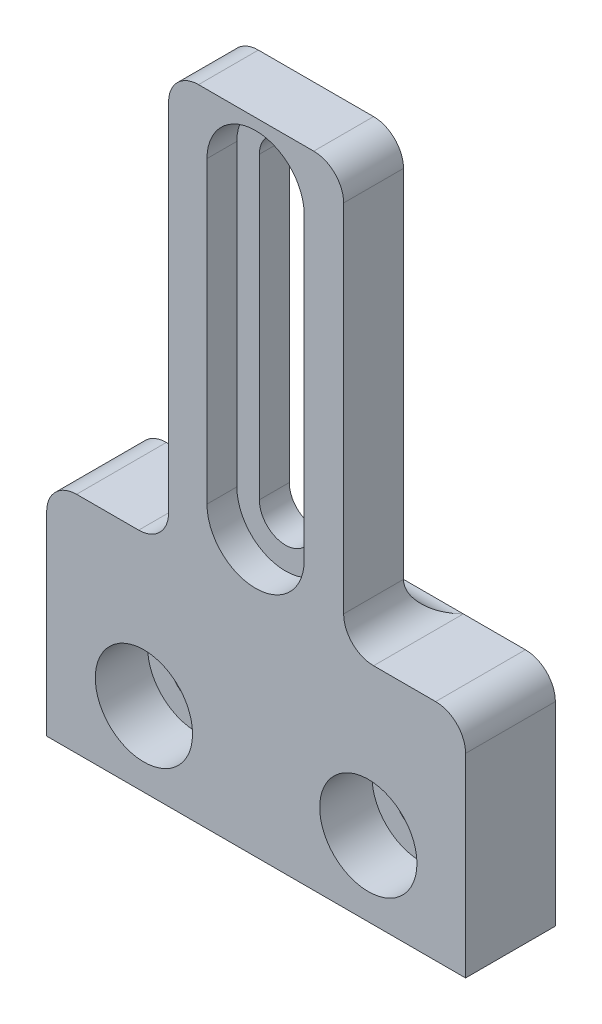
ISO-10303-21;
HEADER;
FILE_DESCRIPTION(('STEP AP214'),'2;1');
FILE_NAME('part.step','',(''),(''),'','','');
FILE_SCHEMA(('AUTOMOTIVE_DESIGN { 1 0 10303 214 1 1 1 1 }'));
ENDSEC;
DATA;
#1=APPLICATION_CONTEXT('core data for automotive mechanical design processes');
#2=APPLICATION_PROTOCOL_DEFINITION('international standard','automotive_design',2000,#1);
#3=PRODUCT_CONTEXT('',#1,'mechanical');
#4=PRODUCT('Part','Part','',(#3));
#5=PRODUCT_RELATED_PRODUCT_CATEGORY('part','',(#4));
#6=PRODUCT_DEFINITION_FORMATION('','',#4);
#7=PRODUCT_DEFINITION_CONTEXT('part definition',#1,'design');
#8=PRODUCT_DEFINITION('design','',#6,#7);
#9=PRODUCT_DEFINITION_SHAPE('','',#8);
#10=(LENGTH_UNIT() NAMED_UNIT(*) SI_UNIT(.MILLI.,.METRE.));
#11=(NAMED_UNIT(*) PLANE_ANGLE_UNIT() SI_UNIT($,.RADIAN.));
#12=(NAMED_UNIT(*) SI_UNIT($,.STERADIAN.) SOLID_ANGLE_UNIT());
#13=UNCERTAINTY_MEASURE_WITH_UNIT(LENGTH_MEASURE(1.E-05),#10,'distance_accuracy_value','');
#14=(GEOMETRIC_REPRESENTATION_CONTEXT(3) GLOBAL_UNCERTAINTY_ASSIGNED_CONTEXT((#13)) GLOBAL_UNIT_ASSIGNED_CONTEXT((#10,
#11,#12)) REPRESENTATION_CONTEXT('',''));
#15=CARTESIAN_POINT('',(0.,0.,0.));
#16=DIRECTION('',(0.,0.,1.));
#17=DIRECTION('',(1.,0.,0.));
#18=AXIS2_PLACEMENT_3D('',#15,#16,#17);
#19=CARTESIAN_POINT('',(-14.0349366621932,38.7866888397982,0.));
#20=DIRECTION('',(0.,0.,1.));
#21=DIRECTION('',(1.,0.,0.));
#22=AXIS2_PLACEMENT_3D('',#19,#20,#21);
#23=CYLINDRICAL_SURFACE('',#22,1.75);
#24=CARTESIAN_POINT('',(-14.0349366621932,38.7866888397982,4.));
#25=DIRECTION('',(0.,0.,1.));
#26=DIRECTION('',(1.,0.,0.));
#27=AXIS2_PLACEMENT_3D('',#24,#25,#26);
#28=CIRCLE('',#27,1.75);
#29=CARTESIAN_POINT('',(-15.7849366621932,38.7866888397982,4.));
#30=VERTEX_POINT('',#29);
#31=CARTESIAN_POINT('',(-12.2849366621932,38.7866888397982,4.));
#32=VERTEX_POINT('',#31);
#33=EDGE_CURVE('E227',#30,#32,#28,.F.);
#34=ORIENTED_EDGE('',*,*,#33,.F.);
#35=DIRECTION('',(0.,0.,1.));
#36=VECTOR('',#35,1.);
#37=CARTESIAN_POINT('',(-15.7849366621932,38.7866888397982,0.));
#38=LINE('',#37,#36);
#39=CARTESIAN_POINT('',(-15.7849366621932,38.7866888397982,2.));
#40=VERTEX_POINT('',#39);
#41=EDGE_CURVE('E229',#40,#30,#38,.T.);
#42=ORIENTED_EDGE('',*,*,#41,.F.);
#43=CARTESIAN_POINT('',(-14.0349366621932,38.7866888397982,2.));
#44=DIRECTION('',(0.,0.,-1.));
#45=DIRECTION('',(-1.,0.,0.));
#46=AXIS2_PLACEMENT_3D('',#43,#44,#45);
#47=CIRCLE('',#46,1.75);
#48=CARTESIAN_POINT('',(-12.2849366621932,38.7866888397982,2.));
#49=VERTEX_POINT('',#48);
#50=EDGE_CURVE('E339',#40,#49,#47,.T.);
#51=ORIENTED_EDGE('',*,*,#50,.T.);
#52=DIRECTION('',(0.,0.,1.));
#53=VECTOR('',#52,1.);
#54=CARTESIAN_POINT('',(-12.2849366621932,38.7866888397982,0.));
#55=LINE('',#54,#53);
#56=EDGE_CURVE('E233',#49,#32,#55,.T.);
#57=ORIENTED_EDGE('',*,*,#56,.T.);
#58=EDGE_LOOP('',(#34,#42,#51,#57));
#59=FACE_BOUND('',#58,.T.);
#60=ADVANCED_FACE('F38',(#59),#23,.F.);
#61=CARTESIAN_POINT('',(-12.2849366621932,38.7866888397982,0.));
#62=DIRECTION('',(1.,0.,0.));
#63=DIRECTION('',(0.,1.,0.));
#64=AXIS2_PLACEMENT_3D('',#61,#62,#63);
#65=PLANE('',#64);
#66=DIRECTION('',(0.,-1.,0.));
#67=VECTOR('',#66,1.);
#68=CARTESIAN_POINT('',(-12.2849366621932,38.7866888397982,4.));
#69=LINE('',#68,#67);
#70=CARTESIAN_POINT('',(-12.2849366621932,18.7866888397982,4.));
#71=VERTEX_POINT('',#70);
#72=EDGE_CURVE('E225',#32,#71,#69,.T.);
#73=ORIENTED_EDGE('',*,*,#72,.F.);
#74=ORIENTED_EDGE('',*,*,#56,.F.);
#75=DIRECTION('',(0.,-1.,0.));
#76=VECTOR('',#75,1.);
#77=CARTESIAN_POINT('',(-12.2849366621932,0.,2.));
#78=LINE('',#77,#76);
#79=CARTESIAN_POINT('',(-12.2849366621932,18.7866888397982,2.));
#80=VERTEX_POINT('',#79);
#81=EDGE_CURVE('E337',#49,#80,#78,.T.);
#82=ORIENTED_EDGE('',*,*,#81,.T.);
#83=DIRECTION('',(0.,0.,1.));
#84=VECTOR('',#83,1.);
#85=CARTESIAN_POINT('',(-12.2849366621932,18.7866888397982,0.));
#86=LINE('',#85,#84);
#87=EDGE_CURVE('E230',#80,#71,#86,.T.);
#88=ORIENTED_EDGE('',*,*,#87,.T.);
#89=EDGE_LOOP('',(#73,#74,#82,#88));
#90=FACE_BOUND('',#89,.T.);
#91=ADVANCED_FACE('F452',(#90),#65,.F.);
#92=CARTESIAN_POINT('',(-14.0349366621932,18.7866888397982,0.));
#93=DIRECTION('',(0.,0.,1.));
#94=DIRECTION('',(1.,0.,0.));
#95=AXIS2_PLACEMENT_3D('',#92,#93,#94);
#96=CYLINDRICAL_SURFACE('',#95,1.75);
#97=CARTESIAN_POINT('',(-14.0349366621932,18.7866888397982,4.));
#98=DIRECTION('',(0.,0.,1.));
#99=DIRECTION('',(1.,0.,0.));
#100=AXIS2_PLACEMENT_3D('',#97,#98,#99);
#101=CIRCLE('',#100,1.75);
#102=CARTESIAN_POINT('',(-15.7849366621932,18.7866888397982,4.));
#103=VERTEX_POINT('',#102);
#104=EDGE_CURVE('E223',#71,#103,#101,.F.);
#105=ORIENTED_EDGE('',*,*,#104,.F.);
#106=ORIENTED_EDGE('',*,*,#87,.F.);
#107=CARTESIAN_POINT('',(-14.0349366621932,18.7866888397982,2.));
#108=DIRECTION('',(0.,0.,-1.));
#109=DIRECTION('',(-1.,0.,0.));
#110=AXIS2_PLACEMENT_3D('',#107,#108,#109);
#111=CIRCLE('',#110,1.75);
#112=CARTESIAN_POINT('',(-15.7849366621932,18.7866888397982,2.));
#113=VERTEX_POINT('',#112);
#114=EDGE_CURVE('E334',#80,#113,#111,.T.);
#115=ORIENTED_EDGE('',*,*,#114,.T.);
#116=DIRECTION('',(0.,0.,1.));
#117=VECTOR('',#116,1.);
#118=CARTESIAN_POINT('',(-15.7849366621932,18.7866888397982,0.));
#119=LINE('',#118,#117);
#120=EDGE_CURVE('E234',#113,#103,#119,.T.);
#121=ORIENTED_EDGE('',*,*,#120,.T.);
#122=EDGE_LOOP('',(#105,#106,#115,#121));
#123=FACE_BOUND('',#122,.T.);
#124=ADVANCED_FACE('F458',(#123),#96,.F.);
#125=CARTESIAN_POINT('',(-15.7849366621932,38.7866888397982,0.));
#126=DIRECTION('',(-1.,0.,0.));
#127=DIRECTION('',(0.,-1.,0.));
#128=AXIS2_PLACEMENT_3D('',#125,#126,#127);
#129=PLANE('',#128);
#130=DIRECTION('',(0.,1.,0.));
#131=VECTOR('',#130,1.);
#132=CARTESIAN_POINT('',(-15.7849366621932,38.7866888397982,4.));
#133=LINE('',#132,#131);
#134=EDGE_CURVE('E341',#103,#30,#133,.T.);
#135=ORIENTED_EDGE('',*,*,#134,.F.);
#136=ORIENTED_EDGE('',*,*,#120,.F.);
#137=DIRECTION('',(0.,1.,0.));
#138=VECTOR('',#137,1.);
#139=CARTESIAN_POINT('',(-15.7849366621932,0.,2.));
#140=LINE('',#139,#138);
#141=EDGE_CURVE('E332',#113,#40,#140,.T.);
#142=ORIENTED_EDGE('',*,*,#141,.T.);
#143=ORIENTED_EDGE('',*,*,#41,.T.);
#144=EDGE_LOOP('',(#135,#136,#142,#143));
#145=FACE_BOUND('',#144,.T.);
#146=ADVANCED_FACE('F464',(#145),#129,.F.);
#147=CARTESIAN_POINT('',(-28.,15.,6.));
#148=DIRECTION('',(0.,-1.,0.));
#149=DIRECTION('',(0.,0.,-1.));
#150=AXIS2_PLACEMENT_3D('',#147,#148,#149);
#151=PLANE('',#150);
#152=DIRECTION('',(-1.,0.,0.));
#153=VECTOR('',#152,1.);
#154=CARTESIAN_POINT('',(-28.,15.,0.));
#155=LINE('',#154,#153);
#156=CARTESIAN_POINT('',(-21.85,15.,0.));
#157=VERTEX_POINT('',#156);
#158=CARTESIAN_POINT('',(-26.,15.,0.));
#159=VERTEX_POINT('',#158);
#160=EDGE_CURVE('E296',#157,#159,#155,.T.);
#161=ORIENTED_EDGE('',*,*,#160,.T.);
#162=DIRECTION('',(0.,0.,-1.));
#163=VECTOR('',#162,1.);
#164=CARTESIAN_POINT('',(-26.,15.,6.));
#165=LINE('',#164,#163);
#166=CARTESIAN_POINT('',(-26.,15.,6.));
#167=VERTEX_POINT('',#166);
#168=EDGE_CURVE('E11',#159,#167,#165,.F.);
#169=ORIENTED_EDGE('',*,*,#168,.T.);
#170=DIRECTION('',(-1.,0.,0.));
#171=VECTOR('',#170,1.);
#172=CARTESIAN_POINT('',(-28.,15.,6.));
#173=LINE('',#172,#171);
#174=CARTESIAN_POINT('',(-21.85,15.,6.));
#175=VERTEX_POINT('',#174);
#176=EDGE_CURVE('E286',#175,#167,#173,.T.);
#177=ORIENTED_EDGE('',*,*,#176,.F.);
#178=DIRECTION('',(0.,0.,-1.));
#179=VECTOR('',#178,1.);
#180=CARTESIAN_POINT('',(-21.85,15.,6.));
#181=LINE('',#180,#179);
#182=EDGE_CURVE('E323',#175,#157,#181,.T.);
#183=ORIENTED_EDGE('',*,*,#182,.T.);
#184=EDGE_LOOP('',(#161,#169,#177,#183));
#185=FACE_BOUND('',#184,.T.);
#186=ADVANCED_FACE('F446',(#185),#151,.F.);
#187=CARTESIAN_POINT('',(-8.15,15.,6.));
#188=DIRECTION('',(1.,0.,0.));
#189=DIRECTION('',(0.,0.,-1.));
#190=AXIS2_PLACEMENT_3D('',#187,#188,#189);
#191=PLANE('',#190);
#192=DIRECTION('',(0.,-1.,0.));
#193=VECTOR('',#192,1.);
#194=CARTESIAN_POINT('',(-8.15,42.7866888397982,2.));
#195=LINE('',#194,#193);
#196=CARTESIAN_POINT('',(-8.15,40.7866888397982,2.));
#197=VERTEX_POINT('',#196);
#198=CARTESIAN_POINT('',(-8.15,17.,2.));
#199=VERTEX_POINT('',#198);
#200=EDGE_CURVE('E237',#197,#199,#195,.T.);
#201=ORIENTED_EDGE('',*,*,#200,.F.);
#202=DIRECTION('',(0.,0.,-1.));
#203=VECTOR('',#202,1.);
#204=CARTESIAN_POINT('',(-8.15,40.7866888397982,6.));
#205=LINE('',#204,#203);
#206=CARTESIAN_POINT('',(-8.15,40.7866888397982,6.));
#207=VERTEX_POINT('',#206);
#208=EDGE_CURVE('E359',#197,#207,#205,.F.);
#209=ORIENTED_EDGE('',*,*,#208,.T.);
#210=DIRECTION('',(0.,-1.,0.));
#211=VECTOR('',#210,1.);
#212=CARTESIAN_POINT('',(-8.15,15.,6.));
#213=LINE('',#212,#211);
#214=CARTESIAN_POINT('',(-8.15,17.,6.));
#215=VERTEX_POINT('',#214);
#216=EDGE_CURVE('E249',#207,#215,#213,.T.);
#217=ORIENTED_EDGE('',*,*,#216,.T.);
#218=DIRECTION('',(0.,0.,-1.));
#219=VECTOR('',#218,1.);
#220=CARTESIAN_POINT('',(-8.15,17.,6.));
#221=LINE('',#220,#219);
#222=EDGE_CURVE('E311',#215,#199,#221,.T.);
#223=ORIENTED_EDGE('',*,*,#222,.T.);
#224=EDGE_LOOP('',(#201,#209,#217,#223));
#225=FACE_BOUND('',#224,.T.);
#226=ADVANCED_FACE('F472',(#225),#191,.T.);
#227=CARTESIAN_POINT('',(-8.15,42.7866888397982,6.));
#228=DIRECTION('',(0.,1.,0.));
#229=DIRECTION('',(0.,0.,1.));
#230=AXIS2_PLACEMENT_3D('',#227,#228,#229);
#231=PLANE('',#230);
#232=DIRECTION('',(1.,0.,0.));
#233=VECTOR('',#232,1.);
#234=CARTESIAN_POINT('',(-8.15,42.7866888397982,6.));
#235=LINE('',#234,#233);
#236=CARTESIAN_POINT('',(-17.85,42.7866888397982,6.));
#237=VERTEX_POINT('',#236);
#238=CARTESIAN_POINT('',(-10.15,42.7866888397982,6.));
#239=VERTEX_POINT('',#238);
#240=EDGE_CURVE('E254',#237,#239,#235,.T.);
#241=ORIENTED_EDGE('',*,*,#240,.T.);
#242=DIRECTION('',(0.,0.,-1.));
#243=VECTOR('',#242,1.);
#244=CARTESIAN_POINT('',(-10.15,42.7866888397982,6.));
#245=LINE('',#244,#243);
#246=CARTESIAN_POINT('',(-10.15,42.7866888397982,2.));
#247=VERTEX_POINT('',#246);
#248=EDGE_CURVE('E352',#239,#247,#245,.T.);
#249=ORIENTED_EDGE('',*,*,#248,.T.);
#250=DIRECTION('',(1.,0.,0.));
#251=VECTOR('',#250,1.);
#252=CARTESIAN_POINT('',(-8.15,42.7866888397982,2.));
#253=LINE('',#252,#251);
#254=CARTESIAN_POINT('',(-17.85,42.7866888397982,2.));
#255=VERTEX_POINT('',#254);
#256=EDGE_CURVE('E246',#255,#247,#253,.T.);
#257=ORIENTED_EDGE('',*,*,#256,.F.);
#258=DIRECTION('',(0.,0.,-1.));
#259=VECTOR('',#258,1.);
#260=CARTESIAN_POINT('',(-17.85,42.7866888397982,6.));
#261=LINE('',#260,#259);
#262=EDGE_CURVE('E350',#255,#237,#261,.F.);
#263=ORIENTED_EDGE('',*,*,#262,.T.);
#264=EDGE_LOOP('',(#241,#249,#257,#263));
#265=FACE_BOUND('',#264,.T.);
#266=ADVANCED_FACE('F428',(#265),#231,.T.);
#267=CARTESIAN_POINT('',(-19.85,15.,6.));
#268=DIRECTION('',(-1.,0.,0.));
#269=DIRECTION('',(0.,0.,1.));
#270=AXIS2_PLACEMENT_3D('',#267,#268,#269);
#271=PLANE('',#270);
#272=DIRECTION('',(0.,1.,0.));
#273=VECTOR('',#272,1.);
#274=CARTESIAN_POINT('',(-19.85,15.,6.));
#275=LINE('',#274,#273);
#276=CARTESIAN_POINT('',(-19.85,17.,6.));
#277=VERTEX_POINT('',#276);
#278=CARTESIAN_POINT('',(-19.85,40.7866888397982,6.));
#279=VERTEX_POINT('',#278);
#280=EDGE_CURVE('E251',#277,#279,#275,.T.);
#281=ORIENTED_EDGE('',*,*,#280,.T.);
#282=DIRECTION('',(0.,0.,-1.));
#283=VECTOR('',#282,1.);
#284=CARTESIAN_POINT('',(-19.85,40.7866888397982,6.));
#285=LINE('',#284,#283);
#286=CARTESIAN_POINT('',(-19.85,40.7866888397982,2.));
#287=VERTEX_POINT('',#286);
#288=EDGE_CURVE('E365',#279,#287,#285,.T.);
#289=ORIENTED_EDGE('',*,*,#288,.T.);
#290=DIRECTION('',(0.,1.,0.));
#291=VECTOR('',#290,1.);
#292=CARTESIAN_POINT('',(-19.85,42.7866888397982,2.));
#293=LINE('',#292,#291);
#294=CARTESIAN_POINT('',(-19.85,17.,2.));
#295=VERTEX_POINT('',#294);
#296=EDGE_CURVE('E243',#295,#287,#293,.T.);
#297=ORIENTED_EDGE('',*,*,#296,.F.);
#298=DIRECTION('',(0.,0.,-1.));
#299=VECTOR('',#298,1.);
#300=CARTESIAN_POINT('',(-19.85,17.,6.));
#301=LINE('',#300,#299);
#302=EDGE_CURVE('E326',#295,#277,#301,.F.);
#303=ORIENTED_EDGE('',*,*,#302,.T.);
#304=EDGE_LOOP('',(#281,#289,#297,#303));
#305=FACE_BOUND('',#304,.T.);
#306=ADVANCED_FACE('F439',(#305),#271,.T.);
#307=CARTESIAN_POINT('',(-6.5,5.,0.));
#308=DIRECTION('',(0.,0.,1.));
#309=DIRECTION('',(1.,0.,0.));
#310=AXIS2_PLACEMENT_3D('',#307,#308,#309);
#311=CYLINDRICAL_SURFACE('',#310,1.75);
#312=CARTESIAN_POINT('',(-6.5,5.,0.));
#313=DIRECTION('',(0.,0.,1.));
#314=DIRECTION('',(1.,0.,0.));
#315=AXIS2_PLACEMENT_3D('',#312,#313,#314);
#316=CIRCLE('',#315,1.75);
#317=CARTESIAN_POINT('',(-4.75,5.,0.));
#318=VERTEX_POINT('',#317);
#319=EDGE_CURVE('E274',#318,#318,#316,.T.);
#320=ORIENTED_EDGE('',*,*,#319,.F.);
#321=EDGE_LOOP('',(#320));
#322=FACE_BOUND('',#321,.T.);
#323=CARTESIAN_POINT('',(-6.5,5.,2.5));
#324=DIRECTION('',(0.,0.,1.));
#325=DIRECTION('',(1.,0.,0.));
#326=AXIS2_PLACEMENT_3D('',#323,#324,#325);
#327=CIRCLE('',#326,1.75);
#328=CARTESIAN_POINT('',(-4.75,5.,2.5));
#329=VERTEX_POINT('',#328);
#330=EDGE_CURVE('E277',#329,#329,#327,.F.);
#331=ORIENTED_EDGE('',*,*,#330,.F.);
#332=EDGE_LOOP('',(#331));
#333=FACE_BOUND('',#332,.T.);
#334=ADVANCED_FACE('F475',(#322,#333),#311,.F.);
#335=CARTESIAN_POINT('',(-21.5,5.,0.));
#336=DIRECTION('',(0.,0.,1.));
#337=DIRECTION('',(1.,0.,0.));
#338=AXIS2_PLACEMENT_3D('',#335,#336,#337);
#339=CYLINDRICAL_SURFACE('',#338,1.75);
#340=CARTESIAN_POINT('',(-21.5,5.,0.));
#341=DIRECTION('',(0.,0.,1.));
#342=DIRECTION('',(1.,0.,0.));
#343=AXIS2_PLACEMENT_3D('',#340,#341,#342);
#344=CIRCLE('',#343,1.75);
#345=CARTESIAN_POINT('',(-19.75,5.,0.));
#346=VERTEX_POINT('',#345);
#347=EDGE_CURVE('E270',#346,#346,#344,.T.);
#348=ORIENTED_EDGE('',*,*,#347,.F.);
#349=EDGE_LOOP('',(#348));
#350=FACE_BOUND('',#349,.T.);
#351=CARTESIAN_POINT('',(-21.5,5.,2.5));
#352=DIRECTION('',(0.,0.,1.));
#353=DIRECTION('',(1.,0.,0.));
#354=AXIS2_PLACEMENT_3D('',#351,#352,#353);
#355=CIRCLE('',#354,1.75);
#356=CARTESIAN_POINT('',(-19.75,5.,2.5));
#357=VERTEX_POINT('',#356);
#358=EDGE_CURVE('E261',#357,#357,#355,.F.);
#359=ORIENTED_EDGE('',*,*,#358,.F.);
#360=EDGE_LOOP('',(#359));
#361=FACE_BOUND('',#360,.T.);
#362=ADVANCED_FACE('F493',(#350,#361),#339,.F.);
#363=CARTESIAN_POINT('',(-28.,15.,6.));
#364=DIRECTION('',(1.,0.,0.));
#365=DIRECTION('',(0.,0.,-1.));
#366=AXIS2_PLACEMENT_3D('',#363,#364,#365);
#367=PLANE('',#366);
#368=DIRECTION('',(0.,-1.,0.));
#369=VECTOR('',#368,1.);
#370=CARTESIAN_POINT('',(-28.,15.,6.));
#371=LINE('',#370,#369);
#372=CARTESIAN_POINT('',(-28.,13.,6.));
#373=VERTEX_POINT('',#372);
#374=CARTESIAN_POINT('',(-28.,0.,6.));
#375=VERTEX_POINT('',#374);
#376=EDGE_CURVE('E278',#373,#375,#371,.T.);
#377=ORIENTED_EDGE('',*,*,#376,.F.);
#378=DIRECTION('',(0.,0.,-1.));
#379=VECTOR('',#378,1.);
#380=CARTESIAN_POINT('',(-28.,13.,6.));
#381=LINE('',#380,#379);
#382=CARTESIAN_POINT('',(-28.,13.,0.));
#383=VERTEX_POINT('',#382);
#384=EDGE_CURVE('E46',#373,#383,#381,.T.);
#385=ORIENTED_EDGE('',*,*,#384,.T.);
#386=DIRECTION('',(0.,-1.,0.));
#387=VECTOR('',#386,1.);
#388=CARTESIAN_POINT('',(-28.,15.,0.));
#389=LINE('',#388,#387);
#390=CARTESIAN_POINT('',(-28.,0.,0.));
#391=VERTEX_POINT('',#390);
#392=EDGE_CURVE('E273',#383,#391,#389,.T.);
#393=ORIENTED_EDGE('',*,*,#392,.T.);
#394=DIRECTION('',(0.,0.,-1.));
#395=VECTOR('',#394,1.);
#396=CARTESIAN_POINT('',(-28.,0.,6.));
#397=LINE('',#396,#395);
#398=EDGE_CURVE('E301',#375,#391,#397,.T.);
#399=ORIENTED_EDGE('',*,*,#398,.F.);
#400=EDGE_LOOP('',(#377,#385,#393,#399));
#401=FACE_BOUND('',#400,.T.);
#402=ADVANCED_FACE('F383',(#401),#367,.F.);
#403=CARTESIAN_POINT('',(-28.,0.,6.));
#404=DIRECTION('',(0.,1.,0.));
#405=DIRECTION('',(0.,0.,1.));
#406=AXIS2_PLACEMENT_3D('',#403,#404,#405);
#407=PLANE('',#406);
#408=DIRECTION('',(1.,0.,0.));
#409=VECTOR('',#408,1.);
#410=CARTESIAN_POINT('',(-28.,0.,0.));
#411=LINE('',#410,#409);
#412=CARTESIAN_POINT('',(0.,0.,0.));
#413=VERTEX_POINT('',#412);
#414=EDGE_CURVE('E291',#391,#413,#411,.T.);
#415=ORIENTED_EDGE('',*,*,#414,.T.);
#416=DIRECTION('',(0.,0.,-1.));
#417=VECTOR('',#416,1.);
#418=CARTESIAN_POINT('',(0.,0.,6.));
#419=LINE('',#418,#417);
#420=CARTESIAN_POINT('',(0.,0.,6.));
#421=VERTEX_POINT('',#420);
#422=EDGE_CURVE('E289',#421,#413,#419,.T.);
#423=ORIENTED_EDGE('',*,*,#422,.F.);
#424=DIRECTION('',(1.,0.,0.));
#425=VECTOR('',#424,1.);
#426=CARTESIAN_POINT('',(-28.,0.,6.));
#427=LINE('',#426,#425);
#428=EDGE_CURVE('E280',#375,#421,#427,.T.);
#429=ORIENTED_EDGE('',*,*,#428,.F.);
#430=ORIENTED_EDGE('',*,*,#398,.T.);
#431=EDGE_LOOP('',(#415,#423,#429,#430));
#432=FACE_BOUND('',#431,.T.);
#433=ADVANCED_FACE('F395',(#432),#407,.F.);
#434=CARTESIAN_POINT('',(0.,15.,6.));
#435=DIRECTION('',(-1.,0.,0.));
#436=DIRECTION('',(0.,-1.,0.));
#437=AXIS2_PLACEMENT_3D('',#434,#435,#436);
#438=PLANE('',#437);
#439=DIRECTION('',(0.,1.,0.));
#440=VECTOR('',#439,1.);
#441=CARTESIAN_POINT('',(0.,15.,0.));
#442=LINE('',#441,#440);
#443=CARTESIAN_POINT('',(0.,13.,0.));
#444=VERTEX_POINT('',#443);
#445=EDGE_CURVE('E293',#413,#444,#442,.T.);
#446=ORIENTED_EDGE('',*,*,#445,.T.);
#447=DIRECTION('',(0.,0.,-1.));
#448=VECTOR('',#447,1.);
#449=CARTESIAN_POINT('',(0.,13.,6.));
#450=LINE('',#449,#448);
#451=CARTESIAN_POINT('',(0.,13.,6.));
#452=VERTEX_POINT('',#451);
#453=EDGE_CURVE('E375',#444,#452,#450,.F.);
#454=ORIENTED_EDGE('',*,*,#453,.T.);
#455=DIRECTION('',(0.,1.,0.));
#456=VECTOR('',#455,1.);
#457=CARTESIAN_POINT('',(0.,15.,6.));
#458=LINE('',#457,#456);
#459=EDGE_CURVE('E283',#421,#452,#458,.T.);
#460=ORIENTED_EDGE('',*,*,#459,.F.);
#461=ORIENTED_EDGE('',*,*,#422,.T.);
#462=EDGE_LOOP('',(#446,#454,#460,#461));
#463=FACE_BOUND('',#462,.T.);
#464=ADVANCED_FACE('F508',(#463),#438,.F.);
#465=CARTESIAN_POINT('',(-2.,15.,6.));
#466=VERTEX_POINT('',#465);
#467=CARTESIAN_POINT('',(-6.15,15.,6.));
#468=VERTEX_POINT('',#467);
#469=EDGE_CURVE('E287',#466,#468,#173,.T.);
#470=ORIENTED_EDGE('',*,*,#469,.F.);
#471=DIRECTION('',(0.,0.,-1.));
#472=VECTOR('',#471,1.);
#473=CARTESIAN_POINT('',(-2.,15.,6.));
#474=LINE('',#473,#472);
#475=CARTESIAN_POINT('',(-2.,15.,0.));
#476=VERTEX_POINT('',#475);
#477=EDGE_CURVE('E368',#466,#476,#474,.T.);
#478=ORIENTED_EDGE('',*,*,#477,.T.);
#479=CARTESIAN_POINT('',(-6.15,15.,0.));
#480=VERTEX_POINT('',#479);
#481=EDGE_CURVE('E281',#476,#480,#155,.T.);
#482=ORIENTED_EDGE('',*,*,#481,.T.);
#483=DIRECTION('',(0.,0.,-1.));
#484=VECTOR('',#483,1.);
#485=CARTESIAN_POINT('',(-6.15,15.,6.));
#486=LINE('',#485,#484);
#487=EDGE_CURVE('E314',#480,#468,#486,.F.);
#488=ORIENTED_EDGE('',*,*,#487,.T.);
#489=EDGE_LOOP('',(#470,#478,#482,#488));
#490=FACE_BOUND('',#489,.T.);
#491=ADVANCED_FACE('F406',(#490),#151,.F.);
#492=CARTESIAN_POINT('',(0.,0.,6.));
#493=DIRECTION('',(0.,0.,1.));
#494=DIRECTION('',(1.,0.,0.));
#495=AXIS2_PLACEMENT_3D('',#492,#493,#494);
#496=PLANE('',#495);
#497=CARTESIAN_POINT('',(-14.0349366621932,38.7866888397982,6.));
#498=DIRECTION('',(0.,0.,1.));
#499=DIRECTION('',(1.,0.,0.));
#500=AXIS2_PLACEMENT_3D('',#497,#498,#499);
#501=CIRCLE('',#500,3.25);
#502=CARTESIAN_POINT('',(-10.7849366621932,38.7866888397982,6.));
#503=VERTEX_POINT('',#502);
#504=CARTESIAN_POINT('',(-17.2849366621932,38.7866888397982,6.));
#505=VERTEX_POINT('',#504);
#506=EDGE_CURVE('E195',#503,#505,#501,.T.);
#507=ORIENTED_EDGE('',*,*,#506,.F.);
#508=DIRECTION('',(0.,1.,0.));
#509=VECTOR('',#508,1.);
#510=CARTESIAN_POINT('',(-10.7849366621932,38.7866888397982,6.));
#511=LINE('',#510,#509);
#512=CARTESIAN_POINT('',(-10.7849366621932,18.7866888397982,6.));
#513=VERTEX_POINT('',#512);
#514=EDGE_CURVE('E347',#513,#503,#511,.T.);
#515=ORIENTED_EDGE('',*,*,#514,.F.);
#516=CARTESIAN_POINT('',(-14.0349366621932,18.7866888397982,6.));
#517=DIRECTION('',(0.,0.,1.));
#518=DIRECTION('',(1.,0.,0.));
#519=AXIS2_PLACEMENT_3D('',#516,#517,#518);
#520=CIRCLE('',#519,3.25);
#521=CARTESIAN_POINT('',(-17.2849366621932,18.7866888397982,6.));
#522=VERTEX_POINT('',#521);
#523=EDGE_CURVE('E345',#522,#513,#520,.T.);
#524=ORIENTED_EDGE('',*,*,#523,.F.);
#525=DIRECTION('',(0.,1.,0.));
#526=VECTOR('',#525,1.);
#527=CARTESIAN_POINT('',(-17.2849366621932,38.7866888397982,6.));
#528=LINE('',#527,#526);
#529=EDGE_CURVE('E343',#505,#522,#528,.F.);
#530=ORIENTED_EDGE('',*,*,#529,.F.);
#531=EDGE_LOOP('',(#507,#515,#524,#530));
#532=FACE_BOUND('',#531,.T.);
#533=CARTESIAN_POINT('',(-21.5,5.,6.));
#534=DIRECTION('',(0.,0.,1.));
#535=DIRECTION('',(1.,0.,0.));
#536=AXIS2_PLACEMENT_3D('',#533,#534,#535);
#537=CIRCLE('',#536,3.25);
#538=CARTESIAN_POINT('',(-18.25,5.,6.));
#539=VERTEX_POINT('',#538);
#540=EDGE_CURVE('E262',#539,#539,#537,.T.);
#541=ORIENTED_EDGE('',*,*,#540,.F.);
#542=EDGE_LOOP('',(#541));
#543=FACE_BOUND('',#542,.T.);
#544=CARTESIAN_POINT('',(-6.5,5.,6.));
#545=DIRECTION('',(0.,0.,1.));
#546=DIRECTION('',(1.,0.,0.));
#547=AXIS2_PLACEMENT_3D('',#544,#545,#546);
#548=CIRCLE('',#547,3.25);
#549=CARTESIAN_POINT('',(-3.25,5.,6.));
#550=VERTEX_POINT('',#549);
#551=EDGE_CURVE('E265',#550,#550,#548,.T.);
#552=ORIENTED_EDGE('',*,*,#551,.F.);
#553=EDGE_LOOP('',(#552));
#554=FACE_BOUND('',#553,.T.);
#555=ORIENTED_EDGE('',*,*,#459,.T.);
#556=CARTESIAN_POINT('',(-2.,13.,6.));
#557=DIRECTION('',(0.,0.,1.));
#558=DIRECTION('',(1.,0.,0.));
#559=AXIS2_PLACEMENT_3D('',#556,#557,#558);
#560=CIRCLE('',#559,2.);
#561=EDGE_CURVE('E378',#452,#466,#560,.T.);
#562=ORIENTED_EDGE('',*,*,#561,.T.);
#563=ORIENTED_EDGE('',*,*,#469,.T.);
#564=CARTESIAN_POINT('',(-6.15,17.,6.));
#565=DIRECTION('',(0.,0.,1.));
#566=DIRECTION('',(1.,0.,0.));
#567=AXIS2_PLACEMENT_3D('',#564,#565,#566);
#568=CIRCLE('',#567,2.);
#569=EDGE_CURVE('E320',#468,#215,#568,.F.);
#570=ORIENTED_EDGE('',*,*,#569,.T.);
#571=ORIENTED_EDGE('',*,*,#216,.F.);
#572=CARTESIAN_POINT('',(-10.15,40.7866888397982,6.));
#573=DIRECTION('',(0.,0.,1.));
#574=DIRECTION('',(1.,0.,0.));
#575=AXIS2_PLACEMENT_3D('',#572,#573,#574);
#576=CIRCLE('',#575,2.);
#577=EDGE_CURVE('E363',#207,#239,#576,.T.);
#578=ORIENTED_EDGE('',*,*,#577,.T.);
#579=ORIENTED_EDGE('',*,*,#240,.F.);
#580=CARTESIAN_POINT('',(-17.85,40.7866888397982,6.));
#581=DIRECTION('',(0.,0.,1.));
#582=DIRECTION('',(1.,0.,0.));
#583=AXIS2_PLACEMENT_3D('',#580,#581,#582);
#584=CIRCLE('',#583,2.);
#585=EDGE_CURVE('E361',#237,#279,#584,.T.);
#586=ORIENTED_EDGE('',*,*,#585,.T.);
#587=ORIENTED_EDGE('',*,*,#280,.F.);
#588=CARTESIAN_POINT('',(-21.85,17.,6.));
#589=DIRECTION('',(0.,0.,1.));
#590=DIRECTION('',(1.,0.,0.));
#591=AXIS2_PLACEMENT_3D('',#588,#589,#590);
#592=CIRCLE('',#591,2.);
#593=EDGE_CURVE('E330',#277,#175,#592,.F.);
#594=ORIENTED_EDGE('',*,*,#593,.T.);
#595=ORIENTED_EDGE('',*,*,#176,.T.);
#596=CARTESIAN_POINT('',(-26.,13.,6.));
#597=DIRECTION('',(0.,0.,1.));
#598=DIRECTION('',(1.,0.,0.));
#599=AXIS2_PLACEMENT_3D('',#596,#597,#598);
#600=CIRCLE('',#599,2.);
#601=EDGE_CURVE('E53',#167,#373,#600,.T.);
#602=ORIENTED_EDGE('',*,*,#601,.T.);
#603=ORIENTED_EDGE('',*,*,#376,.T.);
#604=ORIENTED_EDGE('',*,*,#428,.T.);
#605=EDGE_LOOP('',(#555,#562,#563,#570,#571,#578,#579,#586,#587,#594,#595,#602,#603,#604));
#606=FACE_BOUND('',#605,.T.);
#607=ADVANCED_FACE('F397',(#532,#543,#554,#606),#496,.T.);
#608=CARTESIAN_POINT('',(0.,0.,0.));
#609=DIRECTION('',(0.,0.,1.));
#610=DIRECTION('',(1.,0.,0.));
#611=AXIS2_PLACEMENT_3D('',#608,#609,#610);
#612=PLANE('',#611);
#613=ORIENTED_EDGE('',*,*,#347,.T.);
#614=EDGE_LOOP('',(#613));
#615=FACE_BOUND('',#614,.T.);
#616=ORIENTED_EDGE('',*,*,#319,.T.);
#617=EDGE_LOOP('',(#616));
#618=FACE_BOUND('',#617,.T.);
#619=ORIENTED_EDGE('',*,*,#481,.F.);
#620=CARTESIAN_POINT('',(-2.,13.,0.));
#621=DIRECTION('',(0.,0.,1.));
#622=DIRECTION('',(1.,0.,0.));
#623=AXIS2_PLACEMENT_3D('',#620,#621,#622);
#624=CIRCLE('',#623,2.);
#625=EDGE_CURVE('E373',#476,#444,#624,.F.);
#626=ORIENTED_EDGE('',*,*,#625,.T.);
#627=ORIENTED_EDGE('',*,*,#445,.F.);
#628=ORIENTED_EDGE('',*,*,#414,.F.);
#629=ORIENTED_EDGE('',*,*,#392,.F.);
#630=CARTESIAN_POINT('',(-26.,13.,0.));
#631=DIRECTION('',(0.,0.,1.));
#632=DIRECTION('',(1.,0.,0.));
#633=AXIS2_PLACEMENT_3D('',#630,#631,#632);
#634=CIRCLE('',#633,2.);
#635=EDGE_CURVE('E371',#383,#159,#634,.F.);
#636=ORIENTED_EDGE('',*,*,#635,.T.);
#637=ORIENTED_EDGE('',*,*,#160,.F.);
#638=EDGE_CURVE('E298',#480,#157,#155,.T.);
#639=ORIENTED_EDGE('',*,*,#638,.F.);
#640=EDGE_LOOP('',(#619,#626,#627,#628,#629,#636,#637,#639));
#641=FACE_BOUND('',#640,.T.);
#642=ADVANCED_FACE('F389',(#615,#618,#641),#612,.F.);
#643=CARTESIAN_POINT('',(-21.5,5.,2.5));
#644=DIRECTION('',(0.,0.,1.));
#645=DIRECTION('',(1.,0.,0.));
#646=AXIS2_PLACEMENT_3D('',#643,#644,#645);
#647=PLANE('',#646);
#648=CARTESIAN_POINT('',(-21.5,5.,2.5));
#649=DIRECTION('',(0.,0.,1.));
#650=DIRECTION('',(1.,0.,0.));
#651=AXIS2_PLACEMENT_3D('',#648,#649,#650);
#652=CIRCLE('',#651,3.25);
#653=CARTESIAN_POINT('',(-18.25,5.,2.5));
#654=VERTEX_POINT('',#653);
#655=EDGE_CURVE('E258',#654,#654,#652,.T.);
#656=ORIENTED_EDGE('',*,*,#655,.T.);
#657=EDGE_LOOP('',(#656));
#658=FACE_BOUND('',#657,.T.);
#659=ORIENTED_EDGE('',*,*,#358,.T.);
#660=EDGE_LOOP('',(#659));
#661=FACE_BOUND('',#660,.T.);
#662=ADVANCED_FACE('F478',(#658,#661),#647,.T.);
#663=CARTESIAN_POINT('',(-21.5,5.,2.5));
#664=DIRECTION('',(0.,0.,1.));
#665=DIRECTION('',(1.,0.,0.));
#666=AXIS2_PLACEMENT_3D('',#663,#664,#665);
#667=CYLINDRICAL_SURFACE('',#666,3.25);
#668=ORIENTED_EDGE('',*,*,#655,.F.);
#669=EDGE_LOOP('',(#668));
#670=FACE_BOUND('',#669,.T.);
#671=ORIENTED_EDGE('',*,*,#540,.T.);
#672=EDGE_LOOP('',(#671));
#673=FACE_BOUND('',#672,.T.);
#674=ADVANCED_FACE('F481',(#670,#673),#667,.F.);
#675=CARTESIAN_POINT('',(-6.5,5.,2.5));
#676=DIRECTION('',(0.,0.,1.));
#677=DIRECTION('',(1.,0.,0.));
#678=AXIS2_PLACEMENT_3D('',#675,#676,#677);
#679=PLANE('',#678);
#680=CARTESIAN_POINT('',(-6.5,5.,2.5));
#681=DIRECTION('',(0.,0.,1.));
#682=DIRECTION('',(1.,0.,0.));
#683=AXIS2_PLACEMENT_3D('',#680,#681,#682);
#684=CIRCLE('',#683,3.25);
#685=CARTESIAN_POINT('',(-3.25,5.,2.5));
#686=VERTEX_POINT('',#685);
#687=EDGE_CURVE('E257',#686,#686,#684,.T.);
#688=ORIENTED_EDGE('',*,*,#687,.T.);
#689=EDGE_LOOP('',(#688));
#690=FACE_BOUND('',#689,.T.);
#691=ORIENTED_EDGE('',*,*,#330,.T.);
#692=EDGE_LOOP('',(#691));
#693=FACE_BOUND('',#692,.T.);
#694=ADVANCED_FACE('F485',(#690,#693),#679,.T.);
#695=CARTESIAN_POINT('',(-6.5,5.,2.5));
#696=DIRECTION('',(0.,0.,1.));
#697=DIRECTION('',(1.,0.,0.));
#698=AXIS2_PLACEMENT_3D('',#695,#696,#697);
#699=CYLINDRICAL_SURFACE('',#698,3.25);
#700=ORIENTED_EDGE('',*,*,#687,.F.);
#701=EDGE_LOOP('',(#700));
#702=FACE_BOUND('',#701,.T.);
#703=ORIENTED_EDGE('',*,*,#551,.T.);
#704=EDGE_LOOP('',(#703));
#705=FACE_BOUND('',#704,.T.);
#706=ADVANCED_FACE('F468',(#702,#705),#699,.F.);
#707=CARTESIAN_POINT('',(0.,0.,2.));
#708=DIRECTION('',(0.,0.,-1.));
#709=DIRECTION('',(-1.,0.,0.));
#710=AXIS2_PLACEMENT_3D('',#707,#708,#709);
#711=PLANE('',#710);
#712=ORIENTED_EDGE('',*,*,#50,.F.);
#713=ORIENTED_EDGE('',*,*,#141,.F.);
#714=ORIENTED_EDGE('',*,*,#114,.F.);
#715=ORIENTED_EDGE('',*,*,#81,.F.);
#716=EDGE_LOOP('',(#712,#713,#714,#715));
#717=FACE_BOUND('',#716,.T.);
#718=ORIENTED_EDGE('',*,*,#256,.T.);
#719=CARTESIAN_POINT('',(-10.15,40.7866888397982,2.));
#720=DIRECTION('',(0.,0.,-1.));
#721=DIRECTION('',(-1.,0.,0.));
#722=AXIS2_PLACEMENT_3D('',#719,#720,#721);
#723=CIRCLE('',#722,2.);
#724=EDGE_CURVE('E357',#247,#197,#723,.T.);
#725=ORIENTED_EDGE('',*,*,#724,.T.);
#726=ORIENTED_EDGE('',*,*,#200,.T.);
#727=DIRECTION('',(-1.,0.,0.));
#728=VECTOR('',#727,1.);
#729=CARTESIAN_POINT('',(0.,17.,2.));
#730=LINE('',#729,#728);
#731=EDGE_CURVE('E304',#199,#295,#730,.T.);
#732=ORIENTED_EDGE('',*,*,#731,.T.);
#733=ORIENTED_EDGE('',*,*,#296,.T.);
#734=CARTESIAN_POINT('',(-17.85,40.7866888397982,2.));
#735=DIRECTION('',(0.,0.,-1.));
#736=DIRECTION('',(-1.,0.,0.));
#737=AXIS2_PLACEMENT_3D('',#734,#735,#736);
#738=CIRCLE('',#737,2.);
#739=EDGE_CURVE('E355',#287,#255,#738,.T.);
#740=ORIENTED_EDGE('',*,*,#739,.T.);
#741=EDGE_LOOP('',(#718,#725,#726,#732,#733,#740));
#742=FACE_BOUND('',#741,.T.);
#743=ADVANCED_FACE('F431',(#717,#742),#711,.T.);
#744=CARTESIAN_POINT('',(0.,17.,0.));
#745=DIRECTION('',(-1.,0.,0.));
#746=DIRECTION('',(0.,0.,1.));
#747=AXIS2_PLACEMENT_3D('',#744,#745,#746);
#748=CYLINDRICAL_SURFACE('',#747,2.);
#749=ORIENTED_EDGE('',*,*,#731,.F.);
#750=CARTESIAN_POINT('',(-6.15,17.,0.));
#751=DIRECTION('',(-0.707106781186547,0.,-0.707106781186547));
#752=DIRECTION('',(-0.707106781186547,0.,0.707106781186547));
#753=AXIS2_PLACEMENT_3D('',#750,#751,#752);
#754=ELLIPSE('',#753,2.82842712474619,2.);
#755=EDGE_CURVE('E317',#199,#480,#754,.F.);
#756=ORIENTED_EDGE('',*,*,#755,.T.);
#757=ORIENTED_EDGE('',*,*,#638,.T.);
#758=CARTESIAN_POINT('',(-21.85,17.,0.));
#759=DIRECTION('',(-0.707106781186547,0.,0.707106781186547));
#760=DIRECTION('',(-0.707106781186547,0.,-0.707106781186547));
#761=AXIS2_PLACEMENT_3D('',#758,#759,#760);
#762=ELLIPSE('',#761,2.82842712474619,2.);
#763=EDGE_CURVE('E328',#157,#295,#762,.T.);
#764=ORIENTED_EDGE('',*,*,#763,.T.);
#765=EDGE_LOOP('',(#749,#756,#757,#764));
#766=FACE_BOUND('',#765,.T.);
#767=ADVANCED_FACE('F413',(#766),#748,.F.);
#768=CARTESIAN_POINT('',(-6.15,17.,6.));
#769=DIRECTION('',(0.,0.,-1.));
#770=DIRECTION('',(-1.,0.,0.));
#771=AXIS2_PLACEMENT_3D('',#768,#769,#770);
#772=CYLINDRICAL_SURFACE('',#771,2.);
#773=ORIENTED_EDGE('',*,*,#569,.F.);
#774=ORIENTED_EDGE('',*,*,#487,.F.);
#775=ORIENTED_EDGE('',*,*,#755,.F.);
#776=ORIENTED_EDGE('',*,*,#222,.F.);
#777=EDGE_LOOP('',(#773,#774,#775,#776));
#778=FACE_BOUND('',#777,.T.);
#779=ADVANCED_FACE('F417',(#778),#772,.F.);
#780=CARTESIAN_POINT('',(-21.85,17.,6.));
#781=DIRECTION('',(0.,0.,-1.));
#782=DIRECTION('',(-1.,0.,0.));
#783=AXIS2_PLACEMENT_3D('',#780,#781,#782);
#784=CYLINDRICAL_SURFACE('',#783,2.);
#785=ORIENTED_EDGE('',*,*,#593,.F.);
#786=ORIENTED_EDGE('',*,*,#302,.F.);
#787=ORIENTED_EDGE('',*,*,#763,.F.);
#788=ORIENTED_EDGE('',*,*,#182,.F.);
#789=EDGE_LOOP('',(#785,#786,#787,#788));
#790=FACE_BOUND('',#789,.T.);
#791=ADVANCED_FACE('F445',(#790),#784,.F.);
#792=CARTESIAN_POINT('',(-14.0349366621932,38.7866888397982,4.));
#793=DIRECTION('',(0.,0.,1.));
#794=DIRECTION('',(1.,0.,0.));
#795=AXIS2_PLACEMENT_3D('',#792,#793,#794);
#796=PLANE('',#795);
#797=CARTESIAN_POINT('',(-14.0349366621932,38.7866888397982,4.));
#798=DIRECTION('',(0.,0.,1.));
#799=DIRECTION('',(1.,0.,0.));
#800=AXIS2_PLACEMENT_3D('',#797,#798,#799);
#801=CIRCLE('',#800,3.25);
#802=CARTESIAN_POINT('',(-10.7849366621932,38.7866888397982,4.));
#803=VERTEX_POINT('',#802);
#804=CARTESIAN_POINT('',(-17.2849366621932,38.7866888397982,4.));
#805=VERTEX_POINT('',#804);
#806=EDGE_CURVE('E192',#803,#805,#801,.T.);
#807=ORIENTED_EDGE('',*,*,#806,.T.);
#808=DIRECTION('',(0.,-1.,0.));
#809=VECTOR('',#808,1.);
#810=CARTESIAN_POINT('',(-17.2849366621932,38.7866888397982,4.));
#811=LINE('',#810,#809);
#812=CARTESIAN_POINT('',(-17.2849366621932,18.7866888397982,4.));
#813=VERTEX_POINT('',#812);
#814=EDGE_CURVE('E202',#805,#813,#811,.T.);
#815=ORIENTED_EDGE('',*,*,#814,.T.);
#816=CARTESIAN_POINT('',(-14.0349366621932,18.7866888397982,4.));
#817=DIRECTION('',(0.,0.,1.));
#818=DIRECTION('',(1.,0.,0.));
#819=AXIS2_PLACEMENT_3D('',#816,#817,#818);
#820=CIRCLE('',#819,3.25);
#821=CARTESIAN_POINT('',(-10.7849366621932,18.7866888397982,4.));
#822=VERTEX_POINT('',#821);
#823=EDGE_CURVE('E208',#813,#822,#820,.T.);
#824=ORIENTED_EDGE('',*,*,#823,.T.);
#825=DIRECTION('',(0.,1.,0.));
#826=VECTOR('',#825,1.);
#827=CARTESIAN_POINT('',(-10.7849366621932,38.7866888397982,4.));
#828=LINE('',#827,#826);
#829=EDGE_CURVE('E199',#822,#803,#828,.T.);
#830=ORIENTED_EDGE('',*,*,#829,.T.);
#831=EDGE_LOOP('',(#807,#815,#824,#830));
#832=FACE_BOUND('',#831,.T.);
#833=ORIENTED_EDGE('',*,*,#33,.T.);
#834=ORIENTED_EDGE('',*,*,#72,.T.);
#835=ORIENTED_EDGE('',*,*,#104,.T.);
#836=ORIENTED_EDGE('',*,*,#134,.T.);
#837=EDGE_LOOP('',(#833,#834,#835,#836));
#838=FACE_BOUND('',#837,.T.);
#839=ADVANCED_FACE('F210',(#832,#838),#796,.T.);
#840=CARTESIAN_POINT('',(-14.0349366621932,38.7866888397982,4.));
#841=DIRECTION('',(0.,0.,1.));
#842=DIRECTION('',(1.,0.,0.));
#843=AXIS2_PLACEMENT_3D('',#840,#841,#842);
#844=CYLINDRICAL_SURFACE('',#843,3.25);
#845=ORIENTED_EDGE('',*,*,#506,.T.);
#846=DIRECTION('',(0.,0.,1.));
#847=VECTOR('',#846,1.);
#848=CARTESIAN_POINT('',(-17.2849366621932,38.7866888397982,4.));
#849=LINE('',#848,#847);
#850=EDGE_CURVE('E187',#805,#505,#849,.T.);
#851=ORIENTED_EDGE('',*,*,#850,.F.);
#852=ORIENTED_EDGE('',*,*,#806,.F.);
#853=DIRECTION('',(0.,0.,1.));
#854=VECTOR('',#853,1.);
#855=CARTESIAN_POINT('',(-10.7849366621932,38.7866888397982,4.));
#856=LINE('',#855,#854);
#857=EDGE_CURVE('E221',#803,#503,#856,.T.);
#858=ORIENTED_EDGE('',*,*,#857,.T.);
#859=EDGE_LOOP('',(#845,#851,#852,#858));
#860=FACE_BOUND('',#859,.T.);
#861=ADVANCED_FACE('F189',(#860),#844,.F.);
#862=CARTESIAN_POINT('',(-10.7849366621932,38.7866888397982,4.));
#863=DIRECTION('',(1.,0.,0.));
#864=DIRECTION('',(0.,1.,0.));
#865=AXIS2_PLACEMENT_3D('',#862,#863,#864);
#866=PLANE('',#865);
#867=ORIENTED_EDGE('',*,*,#514,.T.);
#868=ORIENTED_EDGE('',*,*,#857,.F.);
#869=ORIENTED_EDGE('',*,*,#829,.F.);
#870=DIRECTION('',(0.,0.,1.));
#871=VECTOR('',#870,1.);
#872=CARTESIAN_POINT('',(-10.7849366621932,18.7866888397982,4.));
#873=LINE('',#872,#871);
#874=EDGE_CURVE('E218',#822,#513,#873,.T.);
#875=ORIENTED_EDGE('',*,*,#874,.T.);
#876=EDGE_LOOP('',(#867,#868,#869,#875));
#877=FACE_BOUND('',#876,.T.);
#878=ADVANCED_FACE('F583',(#877),#866,.F.);
#879=CARTESIAN_POINT('',(-14.0349366621932,18.7866888397982,4.));
#880=DIRECTION('',(0.,0.,1.));
#881=DIRECTION('',(1.,0.,0.));
#882=AXIS2_PLACEMENT_3D('',#879,#880,#881);
#883=CYLINDRICAL_SURFACE('',#882,3.25);
#884=ORIENTED_EDGE('',*,*,#523,.T.);
#885=ORIENTED_EDGE('',*,*,#874,.F.);
#886=ORIENTED_EDGE('',*,*,#823,.F.);
#887=DIRECTION('',(0.,0.,1.));
#888=VECTOR('',#887,1.);
#889=CARTESIAN_POINT('',(-17.2849366621932,18.7866888397982,4.));
#890=LINE('',#889,#888);
#891=EDGE_CURVE('E198',#813,#522,#890,.T.);
#892=ORIENTED_EDGE('',*,*,#891,.T.);
#893=EDGE_LOOP('',(#884,#885,#886,#892));
#894=FACE_BOUND('',#893,.T.);
#895=ADVANCED_FACE('F571',(#894),#883,.F.);
#896=CARTESIAN_POINT('',(-17.2849366621932,38.7866888397982,4.));
#897=DIRECTION('',(-1.,0.,0.));
#898=DIRECTION('',(0.,0.,1.));
#899=AXIS2_PLACEMENT_3D('',#896,#897,#898);
#900=PLANE('',#899);
#901=ORIENTED_EDGE('',*,*,#529,.T.);
#902=ORIENTED_EDGE('',*,*,#891,.F.);
#903=ORIENTED_EDGE('',*,*,#814,.F.);
#904=ORIENTED_EDGE('',*,*,#850,.T.);
#905=EDGE_LOOP('',(#901,#902,#903,#904));
#906=FACE_BOUND('',#905,.T.);
#907=ADVANCED_FACE('F203',(#906),#900,.F.);
#908=CARTESIAN_POINT('',(-10.15,40.7866888397982,6.));
#909=DIRECTION('',(0.,0.,-1.));
#910=DIRECTION('',(-1.,0.,0.));
#911=AXIS2_PLACEMENT_3D('',#908,#909,#910);
#912=CYLINDRICAL_SURFACE('',#911,2.);
#913=ORIENTED_EDGE('',*,*,#577,.F.);
#914=ORIENTED_EDGE('',*,*,#208,.F.);
#915=ORIENTED_EDGE('',*,*,#724,.F.);
#916=ORIENTED_EDGE('',*,*,#248,.F.);
#917=EDGE_LOOP('',(#913,#914,#915,#916));
#918=FACE_BOUND('',#917,.T.);
#919=ADVANCED_FACE('F425',(#918),#912,.T.);
#920=CARTESIAN_POINT('',(-17.85,40.7866888397982,6.));
#921=DIRECTION('',(0.,0.,-1.));
#922=DIRECTION('',(-1.,0.,0.));
#923=AXIS2_PLACEMENT_3D('',#920,#921,#922);
#924=CYLINDRICAL_SURFACE('',#923,2.);
#925=ORIENTED_EDGE('',*,*,#585,.F.);
#926=ORIENTED_EDGE('',*,*,#262,.F.);
#927=ORIENTED_EDGE('',*,*,#739,.F.);
#928=ORIENTED_EDGE('',*,*,#288,.F.);
#929=EDGE_LOOP('',(#925,#926,#927,#928));
#930=FACE_BOUND('',#929,.T.);
#931=ADVANCED_FACE('F437',(#930),#924,.T.);
#932=CARTESIAN_POINT('',(-2.,13.,6.));
#933=DIRECTION('',(0.,0.,-1.));
#934=DIRECTION('',(-1.,0.,0.));
#935=AXIS2_PLACEMENT_3D('',#932,#933,#934);
#936=CYLINDRICAL_SURFACE('',#935,2.);
#937=ORIENTED_EDGE('',*,*,#561,.F.);
#938=ORIENTED_EDGE('',*,*,#453,.F.);
#939=ORIENTED_EDGE('',*,*,#625,.F.);
#940=ORIENTED_EDGE('',*,*,#477,.F.);
#941=EDGE_LOOP('',(#937,#938,#939,#940));
#942=FACE_BOUND('',#941,.T.);
#943=ADVANCED_FACE('F404',(#942),#936,.T.);
#944=CARTESIAN_POINT('',(-26.,13.,6.));
#945=DIRECTION('',(0.,0.,-1.));
#946=DIRECTION('',(-1.,0.,0.));
#947=AXIS2_PLACEMENT_3D('',#944,#945,#946);
#948=CYLINDRICAL_SURFACE('',#947,2.);
#949=ORIENTED_EDGE('',*,*,#601,.F.);
#950=ORIENTED_EDGE('',*,*,#168,.F.);
#951=ORIENTED_EDGE('',*,*,#635,.F.);
#952=ORIENTED_EDGE('',*,*,#384,.F.);
#953=EDGE_LOOP('',(#949,#950,#951,#952));
#954=FACE_BOUND('',#953,.T.);
#955=ADVANCED_FACE('F40',(#954),#948,.T.);
#956=CLOSED_SHELL('',(#60,#91,#124,#146,#186,#226,#266,#306,#334,#362,#402,#433,#464,#491,#607,
#642,#662,#674,#694,#706,#743,#767,#779,#791,#839,#861,#878,#895,#907,#919,#931,#943,#955));
#957=MANIFOLD_SOLID_BREP('B2',#956);
#958=ADVANCED_BREP_SHAPE_REPRESENTATION('',(#18,#957),#14);
#959=SHAPE_DEFINITION_REPRESENTATION(#9,#958);
ENDSEC;
END-ISO-10303-21;
